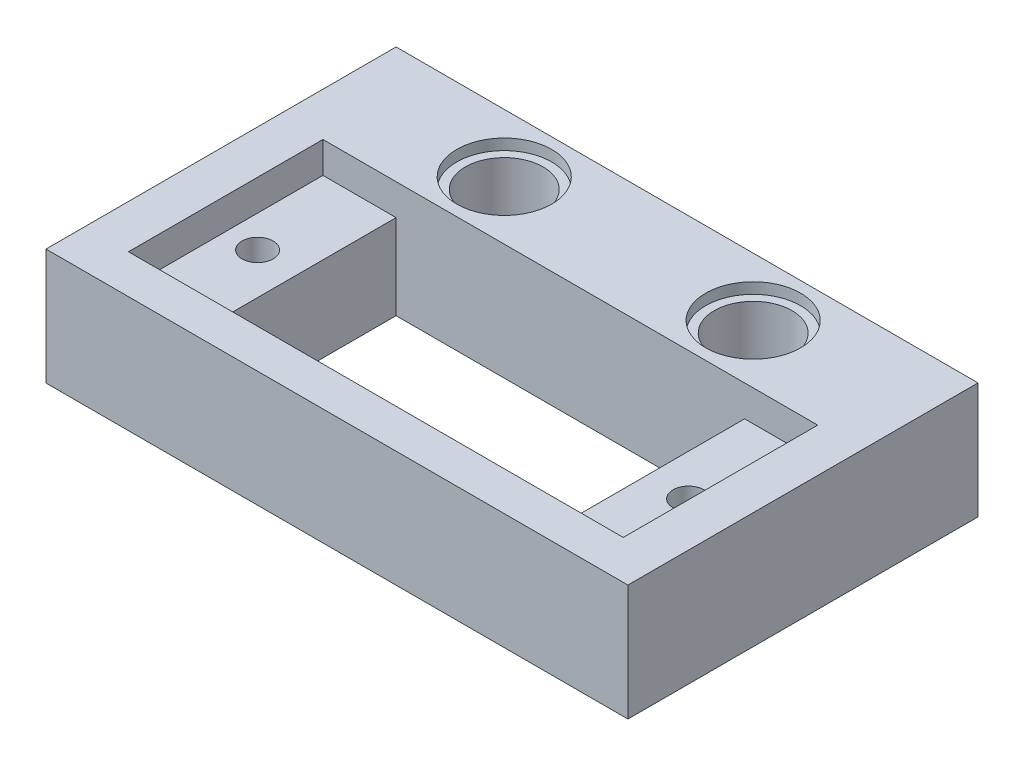
ISO-10303-21;
HEADER;
FILE_DESCRIPTION(('STEP AP214'),'2;1');
FILE_NAME('part.step','',(''),(''),'','','');
FILE_SCHEMA(('AUTOMOTIVE_DESIGN { 1 0 10303 214 1 1 1 1 }'));
ENDSEC;
DATA;
#1=APPLICATION_CONTEXT('core data for automotive mechanical design processes');
#2=APPLICATION_PROTOCOL_DEFINITION('international standard','automotive_design',2000,#1);
#3=PRODUCT_CONTEXT('',#1,'mechanical');
#4=PRODUCT('Part','Part','',(#3));
#5=PRODUCT_RELATED_PRODUCT_CATEGORY('part','',(#4));
#6=PRODUCT_DEFINITION_FORMATION('','',#4);
#7=PRODUCT_DEFINITION_CONTEXT('part definition',#1,'design');
#8=PRODUCT_DEFINITION('design','',#6,#7);
#9=PRODUCT_DEFINITION_SHAPE('','',#8);
#10=(LENGTH_UNIT() NAMED_UNIT(*) SI_UNIT(.MILLI.,.METRE.));
#11=(NAMED_UNIT(*) PLANE_ANGLE_UNIT() SI_UNIT($,.RADIAN.));
#12=(NAMED_UNIT(*) SI_UNIT($,.STERADIAN.) SOLID_ANGLE_UNIT());
#13=UNCERTAINTY_MEASURE_WITH_UNIT(LENGTH_MEASURE(1.E-05),#10,'distance_accuracy_value','');
#14=(GEOMETRIC_REPRESENTATION_CONTEXT(3) GLOBAL_UNCERTAINTY_ASSIGNED_CONTEXT((#13)) GLOBAL_UNIT_ASSIGNED_CONTEXT((#10,
#11,#12)) REPRESENTATION_CONTEXT('',''));
#15=CARTESIAN_POINT('',(0.,0.,0.));
#16=DIRECTION('',(0.,0.,1.));
#17=DIRECTION('',(1.,0.,0.));
#18=AXIS2_PLACEMENT_3D('',#15,#16,#17);
#19=CARTESIAN_POINT('',(-8.,-7.46,-10.));
#20=DIRECTION('',(0.,1.,0.));
#21=DIRECTION('',(0.,0.,1.));
#22=AXIS2_PLACEMENT_3D('',#19,#20,#21);
#23=CYLINDRICAL_SURFACE('',#22,2.5);
#24=CARTESIAN_POINT('',(-8.,-0.7,-10.));
#25=DIRECTION('',(0.,1.,0.));
#26=DIRECTION('',(0.,0.,1.));
#27=AXIS2_PLACEMENT_3D('',#24,#25,#26);
#28=CIRCLE('',#27,2.5);
#29=CARTESIAN_POINT('',(-8.,-0.7,-7.5));
#30=VERTEX_POINT('',#29);
#31=EDGE_CURVE('E156',#30,#30,#28,.F.);
#32=CARTESIAN_POINT('',(-8.,-6.76,-10.));
#33=DIRECTION('',(0.,-1.,0.));
#34=DIRECTION('',(0.,0.,-1.));
#35=AXIS2_PLACEMENT_3D('',#32,#33,#34);
#36=CIRCLE('',#35,2.5);
#37=CARTESIAN_POINT('',(-8.,-6.76,-7.5));
#38=VERTEX_POINT('',#37);
#39=EDGE_CURVE('E37',#38,#38,#36,.F.);
#40=CARTESIAN_POINT('',(-8.,-0.7,-7.5));
#41=CARTESIAN_POINT('',(-8.,-0.763125,-7.5));
#42=CARTESIAN_POINT('',(-8.,-0.82625,-7.5));
#43=CARTESIAN_POINT('',(-8.,-0.9525,-7.5));
#44=CARTESIAN_POINT('',(-8.,-1.015625,-7.5));
#45=CARTESIAN_POINT('',(-8.,-1.141875,-7.5));
#46=CARTESIAN_POINT('',(-8.,-1.205,-7.5));
#47=CARTESIAN_POINT('',(-8.,-1.33125,-7.5));
#48=CARTESIAN_POINT('',(-8.,-1.394375,-7.5));
#49=CARTESIAN_POINT('',(-8.,-1.520625,-7.5));
#50=CARTESIAN_POINT('',(-8.,-1.58375,-7.5));
#51=CARTESIAN_POINT('',(-8.,-1.71,-7.5));
#52=CARTESIAN_POINT('',(-8.,-1.773125,-7.5));
#53=CARTESIAN_POINT('',(-8.,-1.899375,-7.5));
#54=CARTESIAN_POINT('',(-8.,-1.9625,-7.5));
#55=CARTESIAN_POINT('',(-8.,-2.08875,-7.5));
#56=CARTESIAN_POINT('',(-8.,-2.151875,-7.5));
#57=CARTESIAN_POINT('',(-8.,-2.278125,-7.5));
#58=CARTESIAN_POINT('',(-8.,-2.34125,-7.5));
#59=CARTESIAN_POINT('',(-8.,-2.4675,-7.5));
#60=CARTESIAN_POINT('',(-8.,-2.530625,-7.5));
#61=CARTESIAN_POINT('',(-8.,-2.656875,-7.5));
#62=CARTESIAN_POINT('',(-8.,-2.72,-7.5));
#63=CARTESIAN_POINT('',(-8.,-2.84625,-7.5));
#64=CARTESIAN_POINT('',(-8.,-2.909375,-7.5));
#65=CARTESIAN_POINT('',(-8.,-3.035625,-7.5));
#66=CARTESIAN_POINT('',(-8.,-3.09875,-7.5));
#67=CARTESIAN_POINT('',(-8.,-3.225,-7.5));
#68=CARTESIAN_POINT('',(-8.,-3.288125,-7.5));
#69=CARTESIAN_POINT('',(-8.,-3.414375,-7.5));
#70=CARTESIAN_POINT('',(-8.,-3.4775,-7.5));
#71=CARTESIAN_POINT('',(-8.,-3.60375,-7.5));
#72=CARTESIAN_POINT('',(-8.,-3.666875,-7.5));
#73=CARTESIAN_POINT('',(-8.,-3.793125,-7.5));
#74=CARTESIAN_POINT('',(-8.,-3.85625,-7.5));
#75=CARTESIAN_POINT('',(-8.,-3.9825,-7.5));
#76=CARTESIAN_POINT('',(-8.,-4.045625,-7.5));
#77=CARTESIAN_POINT('',(-8.,-4.171875,-7.5));
#78=CARTESIAN_POINT('',(-8.,-4.235,-7.5));
#79=CARTESIAN_POINT('',(-8.,-4.36125,-7.5));
#80=CARTESIAN_POINT('',(-8.,-4.424375,-7.5));
#81=CARTESIAN_POINT('',(-8.,-4.550625,-7.5));
#82=CARTESIAN_POINT('',(-8.,-4.61375,-7.5));
#83=CARTESIAN_POINT('',(-8.,-4.74,-7.5));
#84=CARTESIAN_POINT('',(-8.,-4.803125,-7.5));
#85=CARTESIAN_POINT('',(-8.,-4.929375,-7.5));
#86=CARTESIAN_POINT('',(-8.,-4.9925,-7.5));
#87=CARTESIAN_POINT('',(-8.,-5.11875,-7.5));
#88=CARTESIAN_POINT('',(-8.,-5.181875,-7.5));
#89=CARTESIAN_POINT('',(-8.,-5.308125,-7.5));
#90=CARTESIAN_POINT('',(-8.,-5.37125,-7.5));
#91=CARTESIAN_POINT('',(-8.,-5.4975,-7.5));
#92=CARTESIAN_POINT('',(-8.,-5.560625,-7.5));
#93=CARTESIAN_POINT('',(-8.,-5.686875,-7.5));
#94=CARTESIAN_POINT('',(-8.,-5.75,-7.5));
#95=CARTESIAN_POINT('',(-8.,-5.87625,-7.5));
#96=CARTESIAN_POINT('',(-8.,-5.939375,-7.5));
#97=CARTESIAN_POINT('',(-8.,-6.065625,-7.5));
#98=CARTESIAN_POINT('',(-8.,-6.12875,-7.5));
#99=CARTESIAN_POINT('',(-8.,-6.255,-7.5));
#100=CARTESIAN_POINT('',(-8.,-6.318125,-7.5));
#101=CARTESIAN_POINT('',(-8.,-6.444375,-7.5));
#102=CARTESIAN_POINT('',(-8.,-6.5075,-7.5));
#103=CARTESIAN_POINT('',(-8.,-6.63375,-7.5));
#104=CARTESIAN_POINT('',(-8.,-6.696875,-7.5));
#105=CARTESIAN_POINT('',(-8.,-6.76,-7.5));
#106=B_SPLINE_CURVE_WITH_KNOTS('',3,(#40,#41,#42,#43,#44,#45,#46,#47,#48,#49,#50,#51,#52,#53,
#54,#55,#56,#57,#58,#59,#60,#61,#62,#63,#64,#65,#66,#67,#68,#69,#70,#71,#72,#73,#74,#75,#76,#77,
#78,#79,#80,#81,#82,#83,#84,#85,#86,#87,#88,#89,#90,#91,#92,#93,#94,#95,#96,#97,#98,#99,#100,
#101,#102,#103,#104,#105),.UNSPECIFIED.,.F.,.F.,(4,2,2,2,2,2,2,2,2,2,2,2,2,2,2,2,2,2,2,2,2,2,2,
2,2,2,2,2,2,2,2,2,4),(0.,0.189375,0.37875,0.568125,0.7575,0.946875,1.13625,1.325625,1.515,
1.704375,1.89375,2.083125,2.2725,2.461875,2.65125,2.840625,3.03,3.219375,3.40875,3.598125,
3.7875,3.976875,4.16625,4.355625,4.545,4.734375,4.92375,5.113125,5.3025,5.491875,5.68125,
5.870625,6.06),.UNSPECIFIED.);
#107=EDGE_CURVE('BSEAM33',#30,#38,#106,.T.);
#108=ORIENTED_EDGE('',*,*,#31,.F.);
#109=ORIENTED_EDGE('',*,*,#39,.F.);
#110=ORIENTED_EDGE('',*,*,#107,.T.);
#111=ORIENTED_EDGE('',*,*,#107,.F.);
#112=EDGE_LOOP('',(#108,#110,#109,#111));
#113=FACE_BOUND('',#112,.T.);
#114=ADVANCED_FACE('F33',(#113),#23,.F.);
#115=CARTESIAN_POINT('',(8.,-7.46,-10.));
#116=DIRECTION('',(0.,1.,0.));
#117=DIRECTION('',(0.,0.,1.));
#118=AXIS2_PLACEMENT_3D('',#115,#116,#117);
#119=CYLINDRICAL_SURFACE('',#118,2.5);
#120=CARTESIAN_POINT('',(8.,-0.7,-10.));
#121=DIRECTION('',(0.,1.,0.));
#122=DIRECTION('',(0.,0.,1.));
#123=AXIS2_PLACEMENT_3D('',#120,#121,#122);
#124=CIRCLE('',#123,2.5);
#125=CARTESIAN_POINT('',(8.,-0.7,-7.5));
#126=VERTEX_POINT('',#125);
#127=EDGE_CURVE('E239',#126,#126,#124,.F.);
#128=CARTESIAN_POINT('',(8.,-6.76,-10.));
#129=DIRECTION('',(0.,-1.,0.));
#130=DIRECTION('',(0.,0.,-1.));
#131=AXIS2_PLACEMENT_3D('',#128,#129,#130);
#132=CIRCLE('',#131,2.5);
#133=CARTESIAN_POINT('',(8.,-6.76,-7.5));
#134=VERTEX_POINT('',#133);
#135=EDGE_CURVE('E242',#134,#134,#132,.F.);
#136=CARTESIAN_POINT('',(8.,-0.7,-7.5));
#137=CARTESIAN_POINT('',(8.,-0.763125,-7.5));
#138=CARTESIAN_POINT('',(8.,-0.82625,-7.5));
#139=CARTESIAN_POINT('',(8.,-0.9525,-7.5));
#140=CARTESIAN_POINT('',(8.,-1.015625,-7.5));
#141=CARTESIAN_POINT('',(8.,-1.141875,-7.5));
#142=CARTESIAN_POINT('',(8.,-1.205,-7.5));
#143=CARTESIAN_POINT('',(8.,-1.33125,-7.5));
#144=CARTESIAN_POINT('',(8.,-1.394375,-7.5));
#145=CARTESIAN_POINT('',(8.,-1.520625,-7.5));
#146=CARTESIAN_POINT('',(8.,-1.58375,-7.5));
#147=CARTESIAN_POINT('',(8.,-1.71,-7.5));
#148=CARTESIAN_POINT('',(8.,-1.773125,-7.5));
#149=CARTESIAN_POINT('',(8.,-1.899375,-7.5));
#150=CARTESIAN_POINT('',(8.,-1.9625,-7.5));
#151=CARTESIAN_POINT('',(8.,-2.08875,-7.5));
#152=CARTESIAN_POINT('',(8.,-2.151875,-7.5));
#153=CARTESIAN_POINT('',(8.,-2.278125,-7.5));
#154=CARTESIAN_POINT('',(8.,-2.34125,-7.5));
#155=CARTESIAN_POINT('',(8.,-2.4675,-7.5));
#156=CARTESIAN_POINT('',(8.,-2.530625,-7.5));
#157=CARTESIAN_POINT('',(8.,-2.656875,-7.5));
#158=CARTESIAN_POINT('',(8.,-2.72,-7.5));
#159=CARTESIAN_POINT('',(8.,-2.84625,-7.5));
#160=CARTESIAN_POINT('',(8.,-2.909375,-7.5));
#161=CARTESIAN_POINT('',(8.,-3.035625,-7.5));
#162=CARTESIAN_POINT('',(8.,-3.09875,-7.5));
#163=CARTESIAN_POINT('',(8.,-3.225,-7.5));
#164=CARTESIAN_POINT('',(8.,-3.288125,-7.5));
#165=CARTESIAN_POINT('',(8.,-3.414375,-7.5));
#166=CARTESIAN_POINT('',(8.,-3.4775,-7.5));
#167=CARTESIAN_POINT('',(8.,-3.60375,-7.5));
#168=CARTESIAN_POINT('',(8.,-3.666875,-7.5));
#169=CARTESIAN_POINT('',(8.,-3.793125,-7.5));
#170=CARTESIAN_POINT('',(8.,-3.85625,-7.5));
#171=CARTESIAN_POINT('',(8.,-3.9825,-7.5));
#172=CARTESIAN_POINT('',(8.,-4.045625,-7.5));
#173=CARTESIAN_POINT('',(8.,-4.171875,-7.5));
#174=CARTESIAN_POINT('',(8.,-4.235,-7.5));
#175=CARTESIAN_POINT('',(8.,-4.36125,-7.5));
#176=CARTESIAN_POINT('',(8.,-4.424375,-7.5));
#177=CARTESIAN_POINT('',(8.,-4.550625,-7.5));
#178=CARTESIAN_POINT('',(8.,-4.61375,-7.5));
#179=CARTESIAN_POINT('',(8.,-4.74,-7.5));
#180=CARTESIAN_POINT('',(8.,-4.803125,-7.5));
#181=CARTESIAN_POINT('',(8.,-4.929375,-7.5));
#182=CARTESIAN_POINT('',(8.,-4.9925,-7.5));
#183=CARTESIAN_POINT('',(8.,-5.11875,-7.5));
#184=CARTESIAN_POINT('',(8.,-5.181875,-7.5));
#185=CARTESIAN_POINT('',(8.,-5.308125,-7.5));
#186=CARTESIAN_POINT('',(8.,-5.37125,-7.5));
#187=CARTESIAN_POINT('',(8.,-5.4975,-7.5));
#188=CARTESIAN_POINT('',(8.,-5.560625,-7.5));
#189=CARTESIAN_POINT('',(8.,-5.686875,-7.5));
#190=CARTESIAN_POINT('',(8.,-5.75,-7.5));
#191=CARTESIAN_POINT('',(8.,-5.87625,-7.5));
#192=CARTESIAN_POINT('',(8.,-5.939375,-7.5));
#193=CARTESIAN_POINT('',(8.,-6.065625,-7.5));
#194=CARTESIAN_POINT('',(8.,-6.12875,-7.5));
#195=CARTESIAN_POINT('',(8.,-6.255,-7.5));
#196=CARTESIAN_POINT('',(8.,-6.318125,-7.5));
#197=CARTESIAN_POINT('',(8.,-6.444375,-7.5));
#198=CARTESIAN_POINT('',(8.,-6.5075,-7.5));
#199=CARTESIAN_POINT('',(8.,-6.63375,-7.5));
#200=CARTESIAN_POINT('',(8.,-6.696875,-7.5));
#201=CARTESIAN_POINT('',(8.,-6.76,-7.5));
#202=B_SPLINE_CURVE_WITH_KNOTS('',3,(#136,#137,#138,#139,#140,#141,#142,#143,#144,#145,#146,
#147,#148,#149,#150,#151,#152,#153,#154,#155,#156,#157,#158,#159,#160,#161,#162,#163,#164,#165,
#166,#167,#168,#169,#170,#171,#172,#173,#174,#175,#176,#177,#178,#179,#180,#181,#182,#183,#184,
#185,#186,#187,#188,#189,#190,#191,#192,#193,#194,#195,#196,#197,#198,#199,#200,#201),
.UNSPECIFIED.,.F.,.F.,(4,2,2,2,2,2,2,2,2,2,2,2,2,2,2,2,2,2,2,2,2,2,2,2,2,2,2,2,2,2,2,2,4),(0.,
0.189375,0.37875,0.568125,0.7575,0.946875,1.13625,1.325625,1.515,1.704375,1.89375,2.083125,
2.2725,2.461875,2.65125,2.840625,3.03,3.219375,3.40875,3.598125,3.7875,3.976875,4.16625,
4.355625,4.545,4.734375,4.92375,5.113125,5.3025,5.491875,5.68125,5.870625,6.06),.UNSPECIFIED.);
#203=EDGE_CURVE('BSEAM306',#126,#134,#202,.T.);
#204=ORIENTED_EDGE('',*,*,#127,.F.);
#205=ORIENTED_EDGE('',*,*,#135,.F.);
#206=ORIENTED_EDGE('',*,*,#203,.T.);
#207=ORIENTED_EDGE('',*,*,#203,.F.);
#208=EDGE_LOOP('',(#204,#206,#205,#207));
#209=FACE_BOUND('',#208,.T.);
#210=ADVANCED_FACE('F306',(#209),#119,.F.);
#211=CARTESIAN_POINT('',(11.2,-7.46,-6.25));
#212=DIRECTION('',(1.,0.,0.));
#213=DIRECTION('',(0.,0.,-1.));
#214=AXIS2_PLACEMENT_3D('',#211,#212,#213);
#215=PLANE('',#214);
#216=DIRECTION('',(0.,0.,1.));
#217=VECTOR('',#216,1.);
#218=CARTESIAN_POINT('',(11.2,-2.,-6.25));
#219=LINE('',#218,#217);
#220=CARTESIAN_POINT('',(11.2,-2.,-6.25));
#221=VERTEX_POINT('',#220);
#222=CARTESIAN_POINT('',(11.2,-2.,6.25));
#223=VERTEX_POINT('',#222);
#224=EDGE_CURVE('E171',#221,#223,#219,.T.);
#225=ORIENTED_EDGE('',*,*,#224,.F.);
#226=DIRECTION('',(0.,1.,0.));
#227=VECTOR('',#226,1.);
#228=CARTESIAN_POINT('',(11.2,-7.46,-6.25));
#229=LINE('',#228,#227);
#230=CARTESIAN_POINT('',(11.2,-7.46,-6.25));
#231=VERTEX_POINT('',#230);
#232=EDGE_CURVE('E138',#231,#221,#229,.T.);
#233=ORIENTED_EDGE('',*,*,#232,.F.);
#234=DIRECTION('',(0.,0.,-1.));
#235=VECTOR('',#234,1.);
#236=CARTESIAN_POINT('',(11.2,-7.46,-6.25));
#237=LINE('',#236,#235);
#238=CARTESIAN_POINT('',(11.2,-7.46,6.25));
#239=VERTEX_POINT('',#238);
#240=EDGE_CURVE('E180',#239,#231,#237,.T.);
#241=ORIENTED_EDGE('',*,*,#240,.F.);
#242=DIRECTION('',(0.,1.,0.));
#243=VECTOR('',#242,1.);
#244=CARTESIAN_POINT('',(11.2,-7.46,6.25));
#245=LINE('',#244,#243);
#246=EDGE_CURVE('E195',#239,#223,#245,.T.);
#247=ORIENTED_EDGE('',*,*,#246,.T.);
#248=EDGE_LOOP('',(#225,#233,#241,#247));
#249=FACE_BOUND('',#248,.T.);
#250=ADVANCED_FACE('F312',(#249),#215,.F.);
#251=CARTESIAN_POINT('',(-11.2,-7.46,-6.25));
#252=DIRECTION('',(-1.,0.,0.));
#253=DIRECTION('',(0.,0.,1.));
#254=AXIS2_PLACEMENT_3D('',#251,#252,#253);
#255=PLANE('',#254);
#256=DIRECTION('',(0.,0.,-1.));
#257=VECTOR('',#256,1.);
#258=CARTESIAN_POINT('',(-11.2,-2.,-6.25));
#259=LINE('',#258,#257);
#260=CARTESIAN_POINT('',(-11.2,-2.,6.25));
#261=VERTEX_POINT('',#260);
#262=CARTESIAN_POINT('',(-11.2,-2.,-6.25));
#263=VERTEX_POINT('',#262);
#264=EDGE_CURVE('E169',#261,#263,#259,.T.);
#265=ORIENTED_EDGE('',*,*,#264,.F.);
#266=DIRECTION('',(0.,1.,0.));
#267=VECTOR('',#266,1.);
#268=CARTESIAN_POINT('',(-11.2,-7.46,6.25));
#269=LINE('',#268,#267);
#270=CARTESIAN_POINT('',(-11.2,-7.46,6.25));
#271=VERTEX_POINT('',#270);
#272=EDGE_CURVE('E199',#271,#261,#269,.T.);
#273=ORIENTED_EDGE('',*,*,#272,.F.);
#274=DIRECTION('',(0.,0.,1.));
#275=VECTOR('',#274,1.);
#276=CARTESIAN_POINT('',(-11.2,-7.46,-6.25));
#277=LINE('',#276,#275);
#278=CARTESIAN_POINT('',(-11.2,-7.46,-6.25));
#279=VERTEX_POINT('',#278);
#280=EDGE_CURVE('E187',#279,#271,#277,.T.);
#281=ORIENTED_EDGE('',*,*,#280,.F.);
#282=DIRECTION('',(0.,1.,0.));
#283=VECTOR('',#282,1.);
#284=CARTESIAN_POINT('',(-11.2,-7.46,-6.25));
#285=LINE('',#284,#283);
#286=EDGE_CURVE('E202',#279,#263,#285,.T.);
#287=ORIENTED_EDGE('',*,*,#286,.T.);
#288=EDGE_LOOP('',(#265,#273,#281,#287));
#289=FACE_BOUND('',#288,.T.);
#290=ADVANCED_FACE('F338',(#289),#255,.F.);
#291=CARTESIAN_POINT('',(13.85,-7.46,0.));
#292=DIRECTION('',(0.,1.,0.));
#293=DIRECTION('',(0.,0.,1.));
#294=AXIS2_PLACEMENT_3D('',#291,#292,#293);
#295=CYLINDRICAL_SURFACE('',#294,1.);
#296=CARTESIAN_POINT('',(13.85,-7.46,0.));
#297=DIRECTION('',(0.,1.,0.));
#298=DIRECTION('',(0.,0.,1.));
#299=AXIS2_PLACEMENT_3D('',#296,#297,#298);
#300=CIRCLE('',#299,1.);
#301=CARTESIAN_POINT('',(13.85,-7.46,1.));
#302=VERTEX_POINT('',#301);
#303=EDGE_CURVE('E176',#302,#302,#300,.T.);
#304=CARTESIAN_POINT('',(13.85,-2.,0.));
#305=DIRECTION('',(0.,1.,0.));
#306=DIRECTION('',(0.,0.,1.));
#307=AXIS2_PLACEMENT_3D('',#304,#305,#306);
#308=CIRCLE('',#307,1.);
#309=CARTESIAN_POINT('',(13.85,-2.,1.));
#310=VERTEX_POINT('',#309);
#311=EDGE_CURVE('E166',#310,#310,#308,.F.);
#312=CARTESIAN_POINT('',(13.85,-7.46,1.));
#313=CARTESIAN_POINT('',(13.85,-7.403125,1.));
#314=CARTESIAN_POINT('',(13.85,-7.34625,1.));
#315=CARTESIAN_POINT('',(13.85,-7.2325,1.));
#316=CARTESIAN_POINT('',(13.85,-7.175625,1.));
#317=CARTESIAN_POINT('',(13.85,-7.061875,1.));
#318=CARTESIAN_POINT('',(13.85,-7.005,1.));
#319=CARTESIAN_POINT('',(13.85,-6.89125,1.));
#320=CARTESIAN_POINT('',(13.85,-6.834375,1.));
#321=CARTESIAN_POINT('',(13.85,-6.720625,1.));
#322=CARTESIAN_POINT('',(13.85,-6.66375,1.));
#323=CARTESIAN_POINT('',(13.85,-6.55,1.));
#324=CARTESIAN_POINT('',(13.85,-6.493125,1.));
#325=CARTESIAN_POINT('',(13.85,-6.379375,1.));
#326=CARTESIAN_POINT('',(13.85,-6.3225,1.));
#327=CARTESIAN_POINT('',(13.85,-6.20875,1.));
#328=CARTESIAN_POINT('',(13.85,-6.151875,1.));
#329=CARTESIAN_POINT('',(13.85,-6.038125,1.));
#330=CARTESIAN_POINT('',(13.85,-5.98125,1.));
#331=CARTESIAN_POINT('',(13.85,-5.8675,1.));
#332=CARTESIAN_POINT('',(13.85,-5.810625,1.));
#333=CARTESIAN_POINT('',(13.85,-5.696875,1.));
#334=CARTESIAN_POINT('',(13.85,-5.64,1.));
#335=CARTESIAN_POINT('',(13.85,-5.52625,1.));
#336=CARTESIAN_POINT('',(13.85,-5.469375,1.));
#337=CARTESIAN_POINT('',(13.85,-5.355625,1.));
#338=CARTESIAN_POINT('',(13.85,-5.29875,1.));
#339=CARTESIAN_POINT('',(13.85,-5.185,1.));
#340=CARTESIAN_POINT('',(13.85,-5.128125,1.));
#341=CARTESIAN_POINT('',(13.85,-5.014375,1.));
#342=CARTESIAN_POINT('',(13.85,-4.9575,1.));
#343=CARTESIAN_POINT('',(13.85,-4.84375,1.));
#344=CARTESIAN_POINT('',(13.85,-4.786875,1.));
#345=CARTESIAN_POINT('',(13.85,-4.673125,1.));
#346=CARTESIAN_POINT('',(13.85,-4.61625,1.));
#347=CARTESIAN_POINT('',(13.85,-4.5025,1.));
#348=CARTESIAN_POINT('',(13.85,-4.445625,1.));
#349=CARTESIAN_POINT('',(13.85,-4.331875,1.));
#350=CARTESIAN_POINT('',(13.85,-4.275,1.));
#351=CARTESIAN_POINT('',(13.85,-4.16125,1.));
#352=CARTESIAN_POINT('',(13.85,-4.104375,1.));
#353=CARTESIAN_POINT('',(13.85,-3.990625,1.));
#354=CARTESIAN_POINT('',(13.85,-3.93375,1.));
#355=CARTESIAN_POINT('',(13.85,-3.82,1.));
#356=CARTESIAN_POINT('',(13.85,-3.763125,1.));
#357=CARTESIAN_POINT('',(13.85,-3.649375,1.));
#358=CARTESIAN_POINT('',(13.85,-3.5925,1.));
#359=CARTESIAN_POINT('',(13.85,-3.47875,1.));
#360=CARTESIAN_POINT('',(13.85,-3.421875,1.));
#361=CARTESIAN_POINT('',(13.85,-3.308125,1.));
#362=CARTESIAN_POINT('',(13.85,-3.25125,1.));
#363=CARTESIAN_POINT('',(13.85,-3.1375,1.));
#364=CARTESIAN_POINT('',(13.85,-3.080625,1.));
#365=CARTESIAN_POINT('',(13.85,-2.966875,1.));
#366=CARTESIAN_POINT('',(13.85,-2.91,1.));
#367=CARTESIAN_POINT('',(13.85,-2.79625,1.));
#368=CARTESIAN_POINT('',(13.85,-2.739375,1.));
#369=CARTESIAN_POINT('',(13.85,-2.625625,1.));
#370=CARTESIAN_POINT('',(13.85,-2.56875,1.));
#371=CARTESIAN_POINT('',(13.85,-2.455,1.));
#372=CARTESIAN_POINT('',(13.85,-2.398125,1.));
#373=CARTESIAN_POINT('',(13.85,-2.284375,1.));
#374=CARTESIAN_POINT('',(13.85,-2.2275,1.));
#375=CARTESIAN_POINT('',(13.85,-2.11375,1.));
#376=CARTESIAN_POINT('',(13.85,-2.056875,1.));
#377=CARTESIAN_POINT('',(13.85,-2.,1.));
#378=B_SPLINE_CURVE_WITH_KNOTS('',3,(#312,#313,#314,#315,#316,#317,#318,#319,#320,#321,#322,
#323,#324,#325,#326,#327,#328,#329,#330,#331,#332,#333,#334,#335,#336,#337,#338,#339,#340,#341,
#342,#343,#344,#345,#346,#347,#348,#349,#350,#351,#352,#353,#354,#355,#356,#357,#358,#359,#360,
#361,#362,#363,#364,#365,#366,#367,#368,#369,#370,#371,#372,#373,#374,#375,#376,#377),
.UNSPECIFIED.,.F.,.F.,(4,2,2,2,2,2,2,2,2,2,2,2,2,2,2,2,2,2,2,2,2,2,2,2,2,2,2,2,2,2,2,2,4),(0.,
0.170625000000001,0.34125,0.511875,0.6825,0.853125000000001,1.02375,1.194375,1.365,1.535625,
1.70625,1.876875,2.0475,2.218125,2.38875,2.559375,2.73,2.900625,3.07125,3.241875,3.4125,
3.583125,3.75375,3.924375,4.095,4.265625,4.43625,4.606875,4.7775,4.948125,5.11875,5.289375,
5.46),.UNSPECIFIED.);
#379=EDGE_CURVE('BSEAM334',#302,#310,#378,.T.);
#380=ORIENTED_EDGE('',*,*,#303,.F.);
#381=ORIENTED_EDGE('',*,*,#311,.F.);
#382=ORIENTED_EDGE('',*,*,#379,.T.);
#383=ORIENTED_EDGE('',*,*,#379,.F.);
#384=EDGE_LOOP('',(#380,#382,#381,#383));
#385=FACE_BOUND('',#384,.T.);
#386=ADVANCED_FACE('F334',(#385),#295,.F.);
#387=CARTESIAN_POINT('',(-13.85,-7.46,0.));
#388=DIRECTION('',(0.,1.,0.));
#389=DIRECTION('',(0.,0.,1.));
#390=AXIS2_PLACEMENT_3D('',#387,#388,#389);
#391=CYLINDRICAL_SURFACE('',#390,1.);
#392=CARTESIAN_POINT('',(-13.85,-7.46,0.));
#393=DIRECTION('',(0.,1.,0.));
#394=DIRECTION('',(0.,0.,-1.));
#395=AXIS2_PLACEMENT_3D('',#392,#393,#394);
#396=CIRCLE('',#395,1.);
#397=CARTESIAN_POINT('',(-13.85,-7.46,1.00000000000001));
#398=VERTEX_POINT('',#397);
#399=EDGE_CURVE('E173',#398,#398,#396,.T.);
#400=CARTESIAN_POINT('',(-13.85,-2.,0.));
#401=DIRECTION('',(0.,1.,0.));
#402=DIRECTION('',(0.,0.,1.));
#403=AXIS2_PLACEMENT_3D('',#400,#401,#402);
#404=CIRCLE('',#403,1.);
#405=CARTESIAN_POINT('',(-13.85,-2.,1.00000000000001));
#406=VERTEX_POINT('',#405);
#407=EDGE_CURVE('E160',#406,#406,#404,.F.);
#408=CARTESIAN_POINT('',(-13.85,-7.46,1.00000000000001));
#409=CARTESIAN_POINT('',(-13.85,-7.403125,1.00000000000001));
#410=CARTESIAN_POINT('',(-13.85,-7.34625,1.00000000000001));
#411=CARTESIAN_POINT('',(-13.85,-7.2325,1.00000000000001));
#412=CARTESIAN_POINT('',(-13.85,-7.175625,1.00000000000001));
#413=CARTESIAN_POINT('',(-13.85,-7.061875,1.00000000000001));
#414=CARTESIAN_POINT('',(-13.85,-7.005,1.00000000000001));
#415=CARTESIAN_POINT('',(-13.85,-6.89125,1.00000000000001));
#416=CARTESIAN_POINT('',(-13.85,-6.834375,1.00000000000001));
#417=CARTESIAN_POINT('',(-13.85,-6.720625,1.00000000000001));
#418=CARTESIAN_POINT('',(-13.85,-6.66375,1.00000000000001));
#419=CARTESIAN_POINT('',(-13.85,-6.55,1.00000000000001));
#420=CARTESIAN_POINT('',(-13.85,-6.493125,1.00000000000001));
#421=CARTESIAN_POINT('',(-13.85,-6.379375,1.00000000000001));
#422=CARTESIAN_POINT('',(-13.85,-6.3225,1.00000000000001));
#423=CARTESIAN_POINT('',(-13.85,-6.20875,1.00000000000001));
#424=CARTESIAN_POINT('',(-13.85,-6.151875,1.00000000000001));
#425=CARTESIAN_POINT('',(-13.85,-6.038125,1.00000000000001));
#426=CARTESIAN_POINT('',(-13.85,-5.98125,1.00000000000001));
#427=CARTESIAN_POINT('',(-13.85,-5.8675,1.00000000000001));
#428=CARTESIAN_POINT('',(-13.85,-5.810625,1.00000000000001));
#429=CARTESIAN_POINT('',(-13.85,-5.696875,1.00000000000001));
#430=CARTESIAN_POINT('',(-13.85,-5.64,1.00000000000001));
#431=CARTESIAN_POINT('',(-13.85,-5.52625,1.00000000000001));
#432=CARTESIAN_POINT('',(-13.85,-5.469375,1.00000000000001));
#433=CARTESIAN_POINT('',(-13.85,-5.355625,1.00000000000001));
#434=CARTESIAN_POINT('',(-13.85,-5.29875,1.00000000000001));
#435=CARTESIAN_POINT('',(-13.85,-5.185,1.00000000000001));
#436=CARTESIAN_POINT('',(-13.85,-5.128125,1.00000000000001));
#437=CARTESIAN_POINT('',(-13.85,-5.014375,1.00000000000001));
#438=CARTESIAN_POINT('',(-13.85,-4.9575,1.00000000000001));
#439=CARTESIAN_POINT('',(-13.85,-4.84375,1.00000000000001));
#440=CARTESIAN_POINT('',(-13.85,-4.786875,1.00000000000001));
#441=CARTESIAN_POINT('',(-13.85,-4.673125,1.00000000000001));
#442=CARTESIAN_POINT('',(-13.85,-4.61625,1.00000000000001));
#443=CARTESIAN_POINT('',(-13.85,-4.5025,1.00000000000001));
#444=CARTESIAN_POINT('',(-13.85,-4.445625,1.00000000000001));
#445=CARTESIAN_POINT('',(-13.85,-4.331875,1.00000000000001));
#446=CARTESIAN_POINT('',(-13.85,-4.275,1.00000000000001));
#447=CARTESIAN_POINT('',(-13.85,-4.16125,1.00000000000001));
#448=CARTESIAN_POINT('',(-13.85,-4.104375,1.00000000000001));
#449=CARTESIAN_POINT('',(-13.85,-3.990625,1.00000000000001));
#450=CARTESIAN_POINT('',(-13.85,-3.93375,1.00000000000001));
#451=CARTESIAN_POINT('',(-13.85,-3.82,1.00000000000001));
#452=CARTESIAN_POINT('',(-13.85,-3.763125,1.00000000000001));
#453=CARTESIAN_POINT('',(-13.85,-3.649375,1.00000000000001));
#454=CARTESIAN_POINT('',(-13.85,-3.5925,1.00000000000001));
#455=CARTESIAN_POINT('',(-13.85,-3.47875,1.00000000000001));
#456=CARTESIAN_POINT('',(-13.85,-3.421875,1.00000000000001));
#457=CARTESIAN_POINT('',(-13.85,-3.308125,1.00000000000001));
#458=CARTESIAN_POINT('',(-13.85,-3.25125,1.00000000000001));
#459=CARTESIAN_POINT('',(-13.85,-3.1375,1.00000000000001));
#460=CARTESIAN_POINT('',(-13.85,-3.080625,1.00000000000001));
#461=CARTESIAN_POINT('',(-13.85,-2.966875,1.00000000000001));
#462=CARTESIAN_POINT('',(-13.85,-2.91,1.00000000000001));
#463=CARTESIAN_POINT('',(-13.85,-2.79625,1.00000000000001));
#464=CARTESIAN_POINT('',(-13.85,-2.739375,1.00000000000001));
#465=CARTESIAN_POINT('',(-13.85,-2.625625,1.00000000000001));
#466=CARTESIAN_POINT('',(-13.85,-2.56875,1.00000000000001));
#467=CARTESIAN_POINT('',(-13.85,-2.455,1.00000000000001));
#468=CARTESIAN_POINT('',(-13.85,-2.398125,1.00000000000001));
#469=CARTESIAN_POINT('',(-13.85,-2.284375,1.00000000000001));
#470=CARTESIAN_POINT('',(-13.85,-2.2275,1.00000000000001));
#471=CARTESIAN_POINT('',(-13.85,-2.11375,1.00000000000001));
#472=CARTESIAN_POINT('',(-13.85,-2.056875,1.00000000000001));
#473=CARTESIAN_POINT('',(-13.85,-2.,1.00000000000001));
#474=B_SPLINE_CURVE_WITH_KNOTS('',3,(#408,#409,#410,#411,#412,#413,#414,#415,#416,#417,#418,
#419,#420,#421,#422,#423,#424,#425,#426,#427,#428,#429,#430,#431,#432,#433,#434,#435,#436,#437,
#438,#439,#440,#441,#442,#443,#444,#445,#446,#447,#448,#449,#450,#451,#452,#453,#454,#455,#456,
#457,#458,#459,#460,#461,#462,#463,#464,#465,#466,#467,#468,#469,#470,#471,#472,#473),
.UNSPECIFIED.,.F.,.F.,(4,2,2,2,2,2,2,2,2,2,2,2,2,2,2,2,2,2,2,2,2,2,2,2,2,2,2,2,2,2,2,2,4),(0.,
0.170625000000001,0.34125,0.511875,0.6825,0.853125000000001,1.02375,1.194375,1.365,1.535625,
1.70625,1.876875,2.0475,2.218125,2.38875,2.559375,2.73,2.900625,3.07125,3.241875,3.4125,
3.583125,3.75375,3.924375,4.095,4.265625,4.43625,4.606875,4.7775,4.948125,5.11875,5.289375,
5.46),.UNSPECIFIED.);
#475=EDGE_CURVE('BSEAM331',#398,#406,#474,.T.);
#476=ORIENTED_EDGE('',*,*,#399,.F.);
#477=ORIENTED_EDGE('',*,*,#407,.F.);
#478=ORIENTED_EDGE('',*,*,#475,.T.);
#479=ORIENTED_EDGE('',*,*,#475,.F.);
#480=EDGE_LOOP('',(#476,#478,#477,#479));
#481=FACE_BOUND('',#480,.T.);
#482=ADVANCED_FACE('F331',(#481),#391,.F.);
#483=CARTESIAN_POINT('',(18.7,-7.46,-13.75));
#484=DIRECTION('',(0.,0.,-1.));
#485=DIRECTION('',(-1.,0.,0.));
#486=AXIS2_PLACEMENT_3D('',#483,#484,#485);
#487=PLANE('',#486);
#488=DIRECTION('',(-1.,0.,0.));
#489=VECTOR('',#488,1.);
#490=CARTESIAN_POINT('',(18.7,0.,-13.75));
#491=LINE('',#490,#489);
#492=CARTESIAN_POINT('',(18.7,0.,-13.75));
#493=VERTEX_POINT('',#492);
#494=CARTESIAN_POINT('',(-18.7,0.,-13.75));
#495=VERTEX_POINT('',#494);
#496=EDGE_CURVE('E198',#493,#495,#491,.T.);
#497=ORIENTED_EDGE('',*,*,#496,.F.);
#498=DIRECTION('',(0.,1.,0.));
#499=VECTOR('',#498,1.);
#500=CARTESIAN_POINT('',(18.7,-7.46,-13.75));
#501=LINE('',#500,#499);
#502=CARTESIAN_POINT('',(18.7,-7.46,-13.75));
#503=VERTEX_POINT('',#502);
#504=EDGE_CURVE('E11',#503,#493,#501,.T.);
#505=ORIENTED_EDGE('',*,*,#504,.F.);
#506=DIRECTION('',(-1.,0.,0.));
#507=VECTOR('',#506,1.);
#508=CARTESIAN_POINT('',(18.7,-7.46,-13.75));
#509=LINE('',#508,#507);
#510=CARTESIAN_POINT('',(-18.7,-7.46,-13.75));
#511=VERTEX_POINT('',#510);
#512=EDGE_CURVE('E206',#503,#511,#509,.T.);
#513=ORIENTED_EDGE('',*,*,#512,.T.);
#514=DIRECTION('',(0.,1.,0.));
#515=VECTOR('',#514,1.);
#516=CARTESIAN_POINT('',(-18.7,-7.46,-13.75));
#517=LINE('',#516,#515);
#518=EDGE_CURVE('E219',#511,#495,#517,.T.);
#519=ORIENTED_EDGE('',*,*,#518,.T.);
#520=EDGE_LOOP('',(#497,#505,#513,#519));
#521=FACE_BOUND('',#520,.T.);
#522=ADVANCED_FACE('F35',(#521),#487,.T.);
#523=CARTESIAN_POINT('',(18.7,-7.46,8.75));
#524=DIRECTION('',(1.,0.,0.));
#525=DIRECTION('',(0.,0.,-1.));
#526=AXIS2_PLACEMENT_3D('',#523,#524,#525);
#527=PLANE('',#526);
#528=DIRECTION('',(0.,0.,-1.));
#529=VECTOR('',#528,1.);
#530=CARTESIAN_POINT('',(18.7,0.,8.75));
#531=LINE('',#530,#529);
#532=CARTESIAN_POINT('',(18.7,0.,8.75));
#533=VERTEX_POINT('',#532);
#534=EDGE_CURVE('E210',#533,#493,#531,.T.);
#535=ORIENTED_EDGE('',*,*,#534,.F.);
#536=DIRECTION('',(0.,1.,0.));
#537=VECTOR('',#536,1.);
#538=CARTESIAN_POINT('',(18.7,-7.46,8.75));
#539=LINE('',#538,#537);
#540=CARTESIAN_POINT('',(18.7,-7.46,8.75));
#541=VERTEX_POINT('',#540);
#542=EDGE_CURVE('E42',#541,#533,#539,.T.);
#543=ORIENTED_EDGE('',*,*,#542,.F.);
#544=DIRECTION('',(0.,0.,-1.));
#545=VECTOR('',#544,1.);
#546=CARTESIAN_POINT('',(18.7,-7.46,8.75));
#547=LINE('',#546,#545);
#548=EDGE_CURVE('E216',#541,#503,#547,.T.);
#549=ORIENTED_EDGE('',*,*,#548,.T.);
#550=ORIENTED_EDGE('',*,*,#504,.T.);
#551=EDGE_LOOP('',(#535,#543,#549,#550));
#552=FACE_BOUND('',#551,.T.);
#553=ADVANCED_FACE('F291',(#552),#527,.T.);
#554=CARTESIAN_POINT('',(-18.7,-7.46,8.75));
#555=DIRECTION('',(0.,0.,1.));
#556=DIRECTION('',(1.,0.,0.));
#557=AXIS2_PLACEMENT_3D('',#554,#555,#556);
#558=PLANE('',#557);
#559=DIRECTION('',(1.,0.,0.));
#560=VECTOR('',#559,1.);
#561=CARTESIAN_POINT('',(-18.7,0.,8.75));
#562=LINE('',#561,#560);
#563=CARTESIAN_POINT('',(-18.7,0.,8.75));
#564=VERTEX_POINT('',#563);
#565=EDGE_CURVE('E225',#564,#533,#562,.T.);
#566=ORIENTED_EDGE('',*,*,#565,.F.);
#567=DIRECTION('',(0.,1.,0.));
#568=VECTOR('',#567,1.);
#569=CARTESIAN_POINT('',(-18.7,-7.46,8.75));
#570=LINE('',#569,#568);
#571=CARTESIAN_POINT('',(-18.7,-7.46,8.75));
#572=VERTEX_POINT('',#571);
#573=EDGE_CURVE('E231',#572,#564,#570,.T.);
#574=ORIENTED_EDGE('',*,*,#573,.F.);
#575=DIRECTION('',(1.,0.,0.));
#576=VECTOR('',#575,1.);
#577=CARTESIAN_POINT('',(-18.7,-7.46,8.75));
#578=LINE('',#577,#576);
#579=EDGE_CURVE('E213',#572,#541,#578,.T.);
#580=ORIENTED_EDGE('',*,*,#579,.T.);
#581=ORIENTED_EDGE('',*,*,#542,.T.);
#582=EDGE_LOOP('',(#566,#574,#580,#581));
#583=FACE_BOUND('',#582,.T.);
#584=ADVANCED_FACE('F289',(#583),#558,.T.);
#585=CARTESIAN_POINT('',(-18.7,-7.46,-13.75));
#586=DIRECTION('',(-1.,0.,0.));
#587=DIRECTION('',(0.,0.,1.));
#588=AXIS2_PLACEMENT_3D('',#585,#586,#587);
#589=PLANE('',#588);
#590=DIRECTION('',(0.,0.,1.));
#591=VECTOR('',#590,1.);
#592=CARTESIAN_POINT('',(-18.7,0.,-13.75));
#593=LINE('',#592,#591);
#594=EDGE_CURVE('E222',#495,#564,#593,.T.);
#595=ORIENTED_EDGE('',*,*,#594,.F.);
#596=ORIENTED_EDGE('',*,*,#518,.F.);
#597=DIRECTION('',(0.,0.,1.));
#598=VECTOR('',#597,1.);
#599=CARTESIAN_POINT('',(-18.7,-7.46,-13.75));
#600=LINE('',#599,#598);
#601=EDGE_CURVE('E209',#511,#572,#600,.T.);
#602=ORIENTED_EDGE('',*,*,#601,.T.);
#603=ORIENTED_EDGE('',*,*,#573,.T.);
#604=EDGE_LOOP('',(#595,#596,#602,#603));
#605=FACE_BOUND('',#604,.T.);
#606=ADVANCED_FACE('F285',(#605),#589,.T.);
#607=CARTESIAN_POINT('',(0.,-7.46,0.));
#608=DIRECTION('',(0.,1.,0.));
#609=DIRECTION('',(0.,0.,1.));
#610=AXIS2_PLACEMENT_3D('',#607,#608,#609);
#611=PLANE('',#610);
#612=CARTESIAN_POINT('',(-8.,-7.46,-10.));
#613=DIRECTION('',(0.,-1.,0.));
#614=DIRECTION('',(0.,0.,-1.));
#615=AXIS2_PLACEMENT_3D('',#612,#613,#614);
#616=CIRCLE('',#615,3.05);
#617=CARTESIAN_POINT('',(-8.,-7.46,-13.05));
#618=VERTEX_POINT('',#617);
#619=EDGE_CURVE('E258',#618,#618,#616,.T.);
#620=ORIENTED_EDGE('',*,*,#619,.F.);
#621=EDGE_LOOP('',(#620));
#622=FACE_BOUND('',#621,.T.);
#623=CARTESIAN_POINT('',(8.,-7.46,-10.));
#624=DIRECTION('',(0.,-1.,0.));
#625=DIRECTION('',(0.,0.,-1.));
#626=AXIS2_PLACEMENT_3D('',#623,#624,#625);
#627=CIRCLE('',#626,3.05);
#628=CARTESIAN_POINT('',(8.,-7.46,-13.05));
#629=VERTEX_POINT('',#628);
#630=EDGE_CURVE('E251',#629,#629,#627,.T.);
#631=ORIENTED_EDGE('',*,*,#630,.F.);
#632=EDGE_LOOP('',(#631));
#633=FACE_BOUND('',#632,.T.);
#634=ORIENTED_EDGE('',*,*,#399,.T.);
#635=EDGE_LOOP('',(#634));
#636=FACE_BOUND('',#635,.T.);
#637=ORIENTED_EDGE('',*,*,#303,.T.);
#638=EDGE_LOOP('',(#637));
#639=FACE_BOUND('',#638,.T.);
#640=DIRECTION('',(1.,0.,0.));
#641=VECTOR('',#640,1.);
#642=CARTESIAN_POINT('',(-11.2,-7.46,6.25));
#643=LINE('',#642,#641);
#644=EDGE_CURVE('E190',#271,#239,#643,.T.);
#645=ORIENTED_EDGE('',*,*,#644,.T.);
#646=ORIENTED_EDGE('',*,*,#240,.T.);
#647=DIRECTION('',(-1.,0.,0.));
#648=VECTOR('',#647,1.);
#649=CARTESIAN_POINT('',(-11.2,-7.46,-6.25));
#650=LINE('',#649,#648);
#651=EDGE_CURVE('E183',#231,#279,#650,.T.);
#652=ORIENTED_EDGE('',*,*,#651,.T.);
#653=ORIENTED_EDGE('',*,*,#280,.T.);
#654=EDGE_LOOP('',(#645,#646,#652,#653));
#655=FACE_BOUND('',#654,.T.);
#656=ORIENTED_EDGE('',*,*,#512,.F.);
#657=ORIENTED_EDGE('',*,*,#548,.F.);
#658=ORIENTED_EDGE('',*,*,#579,.F.);
#659=ORIENTED_EDGE('',*,*,#601,.F.);
#660=EDGE_LOOP('',(#656,#657,#658,#659));
#661=FACE_BOUND('',#660,.T.);
#662=ADVANCED_FACE('F274',(#622,#633,#636,#639,#655,#661),#611,.F.);
#663=CARTESIAN_POINT('',(0.,0.,0.));
#664=DIRECTION('',(0.,1.,0.));
#665=DIRECTION('',(0.,0.,1.));
#666=AXIS2_PLACEMENT_3D('',#663,#664,#665);
#667=PLANE('',#666);
#668=CARTESIAN_POINT('',(8.,0.,-10.));
#669=DIRECTION('',(0.,1.,0.));
#670=DIRECTION('',(0.,0.,1.));
#671=AXIS2_PLACEMENT_3D('',#668,#669,#670);
#672=CIRCLE('',#671,3.05);
#673=CARTESIAN_POINT('',(8.,0.,-6.95));
#674=VERTEX_POINT('',#673);
#675=EDGE_CURVE('E244',#674,#674,#672,.T.);
#676=ORIENTED_EDGE('',*,*,#675,.F.);
#677=EDGE_LOOP('',(#676));
#678=FACE_BOUND('',#677,.T.);
#679=CARTESIAN_POINT('',(-8.,0.,-10.));
#680=DIRECTION('',(0.,1.,0.));
#681=DIRECTION('',(0.,0.,1.));
#682=AXIS2_PLACEMENT_3D('',#679,#680,#681);
#683=CIRCLE('',#682,3.05);
#684=CARTESIAN_POINT('',(-8.,0.,-6.95));
#685=VERTEX_POINT('',#684);
#686=EDGE_CURVE('E151',#685,#685,#683,.T.);
#687=ORIENTED_EDGE('',*,*,#686,.F.);
#688=EDGE_LOOP('',(#687));
#689=FACE_BOUND('',#688,.T.);
#690=DIRECTION('',(0.,0.,-1.));
#691=VECTOR('',#690,1.);
#692=CARTESIAN_POINT('',(15.9,0.,-6.25));
#693=LINE('',#692,#691);
#694=CARTESIAN_POINT('',(15.9,0.,6.25));
#695=VERTEX_POINT('',#694);
#696=CARTESIAN_POINT('',(15.9,0.,-6.25));
#697=VERTEX_POINT('',#696);
#698=EDGE_CURVE('E131',#695,#697,#693,.T.);
#699=ORIENTED_EDGE('',*,*,#698,.F.);
#700=DIRECTION('',(1.,0.,0.));
#701=VECTOR('',#700,1.);
#702=CARTESIAN_POINT('',(-11.2,0.,6.25));
#703=LINE('',#702,#701);
#704=CARTESIAN_POINT('',(-15.9,0.,6.25));
#705=VERTEX_POINT('',#704);
#706=EDGE_CURVE('E184',#705,#695,#703,.T.);
#707=ORIENTED_EDGE('',*,*,#706,.F.);
#708=DIRECTION('',(0.,0.,1.));
#709=VECTOR('',#708,1.);
#710=CARTESIAN_POINT('',(-15.9,0.,-6.25));
#711=LINE('',#710,#709);
#712=CARTESIAN_POINT('',(-15.9,0.,-6.25));
#713=VERTEX_POINT('',#712);
#714=EDGE_CURVE('E146',#713,#705,#711,.T.);
#715=ORIENTED_EDGE('',*,*,#714,.F.);
#716=DIRECTION('',(-1.,0.,0.));
#717=VECTOR('',#716,1.);
#718=CARTESIAN_POINT('',(-11.2,0.,-6.25));
#719=LINE('',#718,#717);
#720=EDGE_CURVE('E179',#697,#713,#719,.T.);
#721=ORIENTED_EDGE('',*,*,#720,.F.);
#722=EDGE_LOOP('',(#699,#707,#715,#721));
#723=FACE_BOUND('',#722,.T.);
#724=ORIENTED_EDGE('',*,*,#496,.T.);
#725=ORIENTED_EDGE('',*,*,#594,.T.);
#726=ORIENTED_EDGE('',*,*,#565,.T.);
#727=ORIENTED_EDGE('',*,*,#534,.T.);
#728=EDGE_LOOP('',(#724,#725,#726,#727));
#729=FACE_BOUND('',#728,.T.);
#730=ADVANCED_FACE('F270',(#678,#689,#723,#729),#667,.T.);
#731=CARTESIAN_POINT('',(-11.2,-7.46,6.25));
#732=DIRECTION('',(0.,0.,1.));
#733=DIRECTION('',(1.,0.,0.));
#734=AXIS2_PLACEMENT_3D('',#731,#732,#733);
#735=PLANE('',#734);
#736=ORIENTED_EDGE('',*,*,#706,.T.);
#737=DIRECTION('',(0.,1.,0.));
#738=VECTOR('',#737,1.);
#739=CARTESIAN_POINT('',(15.9,-2.,6.25));
#740=LINE('',#739,#738);
#741=CARTESIAN_POINT('',(15.9,-2.,6.25));
#742=VERTEX_POINT('',#741);
#743=EDGE_CURVE('E158',#742,#695,#740,.T.);
#744=ORIENTED_EDGE('',*,*,#743,.F.);
#745=DIRECTION('',(1.,0.,0.));
#746=VECTOR('',#745,1.);
#747=CARTESIAN_POINT('',(-15.9,-2.,6.25));
#748=LINE('',#747,#746);
#749=EDGE_CURVE('E144',#223,#742,#748,.T.);
#750=ORIENTED_EDGE('',*,*,#749,.F.);
#751=ORIENTED_EDGE('',*,*,#246,.F.);
#752=ORIENTED_EDGE('',*,*,#644,.F.);
#753=ORIENTED_EDGE('',*,*,#272,.T.);
#754=CARTESIAN_POINT('',(-15.9,-2.,6.25));
#755=VERTEX_POINT('',#754);
#756=EDGE_CURVE('E50',#755,#261,#748,.T.);
#757=ORIENTED_EDGE('',*,*,#756,.F.);
#758=DIRECTION('',(0.,1.,0.));
#759=VECTOR('',#758,1.);
#760=CARTESIAN_POINT('',(-15.9,-2.,6.25));
#761=LINE('',#760,#759);
#762=EDGE_CURVE('E161',#755,#705,#761,.T.);
#763=ORIENTED_EDGE('',*,*,#762,.T.);
#764=EDGE_LOOP('',(#736,#744,#750,#751,#752,#753,#757,#763));
#765=FACE_BOUND('',#764,.T.);
#766=ADVANCED_FACE('F273',(#765),#735,.F.);
#767=CARTESIAN_POINT('',(-11.2,-7.46,-6.25));
#768=DIRECTION('',(0.,0.,-1.));
#769=DIRECTION('',(-1.,0.,0.));
#770=AXIS2_PLACEMENT_3D('',#767,#768,#769);
#771=PLANE('',#770);
#772=ORIENTED_EDGE('',*,*,#720,.T.);
#773=DIRECTION('',(0.,1.,0.));
#774=VECTOR('',#773,1.);
#775=CARTESIAN_POINT('',(-15.9,-2.,-6.25));
#776=LINE('',#775,#774);
#777=CARTESIAN_POINT('',(-15.9,-2.,-6.25));
#778=VERTEX_POINT('',#777);
#779=EDGE_CURVE('E133',#778,#713,#776,.T.);
#780=ORIENTED_EDGE('',*,*,#779,.F.);
#781=DIRECTION('',(-1.,0.,0.));
#782=VECTOR('',#781,1.);
#783=CARTESIAN_POINT('',(-15.9,-2.,-6.25));
#784=LINE('',#783,#782);
#785=EDGE_CURVE('E140',#263,#778,#784,.T.);
#786=ORIENTED_EDGE('',*,*,#785,.F.);
#787=ORIENTED_EDGE('',*,*,#286,.F.);
#788=ORIENTED_EDGE('',*,*,#651,.F.);
#789=ORIENTED_EDGE('',*,*,#232,.T.);
#790=CARTESIAN_POINT('',(15.9,-2.,-6.25));
#791=VERTEX_POINT('',#790);
#792=EDGE_CURVE('E58',#791,#221,#784,.T.);
#793=ORIENTED_EDGE('',*,*,#792,.F.);
#794=DIRECTION('',(0.,1.,0.));
#795=VECTOR('',#794,1.);
#796=CARTESIAN_POINT('',(15.9,-2.,-6.25));
#797=LINE('',#796,#795);
#798=EDGE_CURVE('E126',#791,#697,#797,.T.);
#799=ORIENTED_EDGE('',*,*,#798,.T.);
#800=EDGE_LOOP('',(#772,#780,#786,#787,#788,#789,#793,#799));
#801=FACE_BOUND('',#800,.T.);
#802=ADVANCED_FACE('F136',(#801),#771,.F.);
#803=CARTESIAN_POINT('',(0.,-2.,0.));
#804=DIRECTION('',(0.,1.,0.));
#805=DIRECTION('',(0.,0.,1.));
#806=AXIS2_PLACEMENT_3D('',#803,#804,#805);
#807=PLANE('',#806);
#808=ORIENTED_EDGE('',*,*,#407,.T.);
#809=EDGE_LOOP('',(#808));
#810=FACE_BOUND('',#809,.T.);
#811=ORIENTED_EDGE('',*,*,#264,.T.);
#812=ORIENTED_EDGE('',*,*,#785,.T.);
#813=DIRECTION('',(0.,0.,1.));
#814=VECTOR('',#813,1.);
#815=CARTESIAN_POINT('',(-15.9,-2.,-6.25));
#816=LINE('',#815,#814);
#817=EDGE_CURVE('E139',#778,#755,#816,.T.);
#818=ORIENTED_EDGE('',*,*,#817,.T.);
#819=ORIENTED_EDGE('',*,*,#756,.T.);
#820=EDGE_LOOP('',(#811,#812,#818,#819));
#821=FACE_BOUND('',#820,.T.);
#822=ADVANCED_FACE('F324',(#810,#821),#807,.T.);
#823=CARTESIAN_POINT('',(-15.9,-2.,-6.25));
#824=DIRECTION('',(-1.,0.,0.));
#825=DIRECTION('',(0.,0.,1.));
#826=AXIS2_PLACEMENT_3D('',#823,#824,#825);
#827=PLANE('',#826);
#828=ORIENTED_EDGE('',*,*,#714,.T.);
#829=ORIENTED_EDGE('',*,*,#762,.F.);
#830=ORIENTED_EDGE('',*,*,#817,.F.);
#831=ORIENTED_EDGE('',*,*,#779,.T.);
#832=EDGE_LOOP('',(#828,#829,#830,#831));
#833=FACE_BOUND('',#832,.T.);
#834=ADVANCED_FACE('F322',(#833),#827,.F.);
#835=ORIENTED_EDGE('',*,*,#311,.T.);
#836=EDGE_LOOP('',(#835));
#837=FACE_BOUND('',#836,.T.);
#838=ORIENTED_EDGE('',*,*,#224,.T.);
#839=ORIENTED_EDGE('',*,*,#749,.T.);
#840=DIRECTION('',(0.,0.,-1.));
#841=VECTOR('',#840,1.);
#842=CARTESIAN_POINT('',(15.9,-2.,-6.25));
#843=LINE('',#842,#841);
#844=EDGE_CURVE('E129',#742,#791,#843,.T.);
#845=ORIENTED_EDGE('',*,*,#844,.T.);
#846=ORIENTED_EDGE('',*,*,#792,.T.);
#847=EDGE_LOOP('',(#838,#839,#845,#846));
#848=FACE_BOUND('',#847,.T.);
#849=ADVANCED_FACE('F142',(#837,#848),#807,.T.);
#850=CARTESIAN_POINT('',(15.9,-2.,-6.25));
#851=DIRECTION('',(1.,0.,0.));
#852=DIRECTION('',(0.,0.,-1.));
#853=AXIS2_PLACEMENT_3D('',#850,#851,#852);
#854=PLANE('',#853);
#855=ORIENTED_EDGE('',*,*,#698,.T.);
#856=ORIENTED_EDGE('',*,*,#798,.F.);
#857=ORIENTED_EDGE('',*,*,#844,.F.);
#858=ORIENTED_EDGE('',*,*,#743,.T.);
#859=EDGE_LOOP('',(#855,#856,#857,#858));
#860=FACE_BOUND('',#859,.T.);
#861=ADVANCED_FACE('F127',(#860),#854,.F.);
#862=CARTESIAN_POINT('',(-8.,-0.7,-10.));
#863=DIRECTION('',(0.,1.,0.));
#864=DIRECTION('',(0.,0.,1.));
#865=AXIS2_PLACEMENT_3D('',#862,#863,#864);
#866=PLANE('',#865);
#867=CARTESIAN_POINT('',(-8.,-0.7,-10.));
#868=DIRECTION('',(0.,1.,0.));
#869=DIRECTION('',(0.,0.,1.));
#870=AXIS2_PLACEMENT_3D('',#867,#868,#869);
#871=CIRCLE('',#870,3.05);
#872=CARTESIAN_POINT('',(-8.,-0.7,-6.95));
#873=VERTEX_POINT('',#872);
#874=EDGE_CURVE('E238',#873,#873,#871,.T.);
#875=ORIENTED_EDGE('',*,*,#874,.T.);
#876=EDGE_LOOP('',(#875));
#877=FACE_BOUND('',#876,.T.);
#878=ORIENTED_EDGE('',*,*,#31,.T.);
#879=EDGE_LOOP('',(#878));
#880=FACE_BOUND('',#879,.T.);
#881=ADVANCED_FACE('F330',(#877,#880),#866,.T.);
#882=CARTESIAN_POINT('',(-8.,-0.7,-10.));
#883=DIRECTION('',(0.,1.,0.));
#884=DIRECTION('',(0.,0.,1.));
#885=AXIS2_PLACEMENT_3D('',#882,#883,#884);
#886=CYLINDRICAL_SURFACE('',#885,3.05);
#887=ORIENTED_EDGE('',*,*,#874,.F.);
#888=EDGE_LOOP('',(#887));
#889=FACE_BOUND('',#888,.T.);
#890=ORIENTED_EDGE('',*,*,#686,.T.);
#891=EDGE_LOOP('',(#890));
#892=FACE_BOUND('',#891,.T.);
#893=ADVANCED_FACE('F268',(#889,#892),#886,.F.);
#894=CARTESIAN_POINT('',(8.,-0.7,-10.));
#895=DIRECTION('',(0.,1.,0.));
#896=DIRECTION('',(0.,0.,1.));
#897=AXIS2_PLACEMENT_3D('',#894,#895,#896);
#898=PLANE('',#897);
#899=CARTESIAN_POINT('',(8.,-0.7,-10.));
#900=DIRECTION('',(0.,1.,0.));
#901=DIRECTION('',(0.,0.,1.));
#902=AXIS2_PLACEMENT_3D('',#899,#900,#901);
#903=CIRCLE('',#902,3.05);
#904=CARTESIAN_POINT('',(8.,-0.7,-6.95));
#905=VERTEX_POINT('',#904);
#906=EDGE_CURVE('E241',#905,#905,#903,.T.);
#907=ORIENTED_EDGE('',*,*,#906,.T.);
#908=EDGE_LOOP('',(#907));
#909=FACE_BOUND('',#908,.T.);
#910=ORIENTED_EDGE('',*,*,#127,.T.);
#911=EDGE_LOOP('',(#910));
#912=FACE_BOUND('',#911,.T.);
#913=ADVANCED_FACE('F391',(#909,#912),#898,.T.);
#914=CARTESIAN_POINT('',(8.,-0.7,-10.));
#915=DIRECTION('',(0.,1.,0.));
#916=DIRECTION('',(0.,0.,1.));
#917=AXIS2_PLACEMENT_3D('',#914,#915,#916);
#918=CYLINDRICAL_SURFACE('',#917,3.05);
#919=ORIENTED_EDGE('',*,*,#906,.F.);
#920=EDGE_LOOP('',(#919));
#921=FACE_BOUND('',#920,.T.);
#922=ORIENTED_EDGE('',*,*,#675,.T.);
#923=EDGE_LOOP('',(#922));
#924=FACE_BOUND('',#923,.T.);
#925=ADVANCED_FACE('F398',(#921,#924),#918,.F.);
#926=CARTESIAN_POINT('',(8.,-6.76,-10.));
#927=DIRECTION('',(0.,-1.,0.));
#928=DIRECTION('',(0.,0.,-1.));
#929=AXIS2_PLACEMENT_3D('',#926,#927,#928);
#930=PLANE('',#929);
#931=CARTESIAN_POINT('',(8.,-6.76,-10.));
#932=DIRECTION('',(0.,-1.,0.));
#933=DIRECTION('',(0.,0.,-1.));
#934=AXIS2_PLACEMENT_3D('',#931,#932,#933);
#935=CIRCLE('',#934,3.05);
#936=CARTESIAN_POINT('',(8.,-6.76,-13.05));
#937=VERTEX_POINT('',#936);
#938=EDGE_CURVE('E245',#937,#937,#935,.T.);
#939=ORIENTED_EDGE('',*,*,#938,.T.);
#940=EDGE_LOOP('',(#939));
#941=FACE_BOUND('',#940,.T.);
#942=ORIENTED_EDGE('',*,*,#135,.T.);
#943=EDGE_LOOP('',(#942));
#944=FACE_BOUND('',#943,.T.);
#945=ADVANCED_FACE('F405',(#941,#944),#930,.T.);
#946=CARTESIAN_POINT('',(8.,-6.76,-10.));
#947=DIRECTION('',(0.,-1.,0.));
#948=DIRECTION('',(0.,0.,-1.));
#949=AXIS2_PLACEMENT_3D('',#946,#947,#948);
#950=CYLINDRICAL_SURFACE('',#949,3.05);
#951=ORIENTED_EDGE('',*,*,#938,.F.);
#952=EDGE_LOOP('',(#951));
#953=FACE_BOUND('',#952,.T.);
#954=ORIENTED_EDGE('',*,*,#630,.T.);
#955=EDGE_LOOP('',(#954));
#956=FACE_BOUND('',#955,.T.);
#957=ADVANCED_FACE('F422',(#953,#956),#950,.F.);
#958=CARTESIAN_POINT('',(-8.,-6.76,-10.));
#959=DIRECTION('',(0.,-1.,0.));
#960=DIRECTION('',(0.,0.,-1.));
#961=AXIS2_PLACEMENT_3D('',#958,#959,#960);
#962=PLANE('',#961);
#963=CARTESIAN_POINT('',(-8.,-6.76,-10.));
#964=DIRECTION('',(0.,-1.,0.));
#965=DIRECTION('',(0.,0.,-1.));
#966=AXIS2_PLACEMENT_3D('',#963,#964,#965);
#967=CIRCLE('',#966,3.05);
#968=CARTESIAN_POINT('',(-8.,-6.76,-13.05));
#969=VERTEX_POINT('',#968);
#970=EDGE_CURVE('E458',#969,#969,#967,.T.);
#971=ORIENTED_EDGE('',*,*,#970,.T.);
#972=EDGE_LOOP('',(#971));
#973=FACE_BOUND('',#972,.T.);
#974=ORIENTED_EDGE('',*,*,#39,.T.);
#975=EDGE_LOOP('',(#974));
#976=FACE_BOUND('',#975,.T.);
#977=ADVANCED_FACE('F428',(#973,#976),#962,.T.);
#978=CARTESIAN_POINT('',(-8.,-6.76,-10.));
#979=DIRECTION('',(0.,-1.,0.));
#980=DIRECTION('',(0.,0.,-1.));
#981=AXIS2_PLACEMENT_3D('',#978,#979,#980);
#982=CYLINDRICAL_SURFACE('',#981,3.05);
#983=ORIENTED_EDGE('',*,*,#970,.F.);
#984=EDGE_LOOP('',(#983));
#985=FACE_BOUND('',#984,.T.);
#986=ORIENTED_EDGE('',*,*,#619,.T.);
#987=EDGE_LOOP('',(#986));
#988=FACE_BOUND('',#987,.T.);
#989=ADVANCED_FACE('F436',(#985,#988),#982,.F.);
#990=CLOSED_SHELL('',(#114,#210,#250,#290,#386,#482,#522,#553,#584,#606,#662,#730,#766,#802,
#822,#834,#849,#861,#881,#893,#913,#925,#945,#957,#977,#989));
#991=MANIFOLD_SOLID_BREP('B2',#990);
#992=ADVANCED_BREP_SHAPE_REPRESENTATION('',(#18,#991),#14);
#993=SHAPE_DEFINITION_REPRESENTATION(#9,#992);
ENDSEC;
END-ISO-10303-21;
